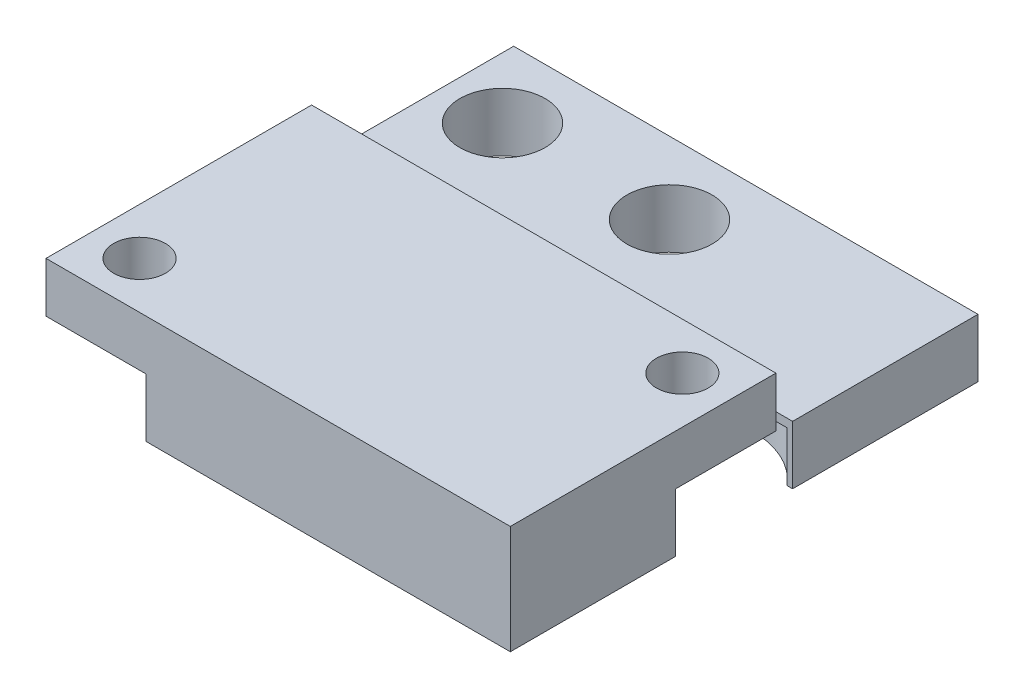
ISO-10303-21;
HEADER;
FILE_DESCRIPTION(('STEP AP214'),'2;1');
FILE_NAME('part.step','',(''),(''),'','','');
FILE_SCHEMA(('AUTOMOTIVE_DESIGN { 1 0 10303 214 1 1 1 1 }'));
ENDSEC;
DATA;
#1=APPLICATION_CONTEXT('core data for automotive mechanical design processes');
#2=APPLICATION_PROTOCOL_DEFINITION('international standard','automotive_design',2000,#1);
#3=PRODUCT_CONTEXT('',#1,'mechanical');
#4=PRODUCT('Part','Part','',(#3));
#5=PRODUCT_RELATED_PRODUCT_CATEGORY('part','',(#4));
#6=PRODUCT_DEFINITION_FORMATION('','',#4);
#7=PRODUCT_DEFINITION_CONTEXT('part definition',#1,'design');
#8=PRODUCT_DEFINITION('design','',#6,#7);
#9=PRODUCT_DEFINITION_SHAPE('','',#8);
#10=(LENGTH_UNIT() NAMED_UNIT(*) SI_UNIT(.MILLI.,.METRE.));
#11=(NAMED_UNIT(*) PLANE_ANGLE_UNIT() SI_UNIT($,.RADIAN.));
#12=(NAMED_UNIT(*) SI_UNIT($,.STERADIAN.) SOLID_ANGLE_UNIT());
#13=UNCERTAINTY_MEASURE_WITH_UNIT(LENGTH_MEASURE(1.E-05),#10,'distance_accuracy_value','');
#14=(GEOMETRIC_REPRESENTATION_CONTEXT(3) GLOBAL_UNCERTAINTY_ASSIGNED_CONTEXT((#13)) GLOBAL_UNIT_ASSIGNED_CONTEXT((#10,
#11,#12)) REPRESENTATION_CONTEXT('',''));
#15=CARTESIAN_POINT('',(0.,0.,0.));
#16=DIRECTION('',(0.,0.,1.));
#17=DIRECTION('',(1.,0.,0.));
#18=AXIS2_PLACEMENT_3D('',#15,#16,#17);
#19=CARTESIAN_POINT('',(21.8,3.5,0.));
#20=DIRECTION('',(1.,0.,0.));
#21=DIRECTION('',(0.,0.,-1.));
#22=AXIS2_PLACEMENT_3D('',#19,#20,#21);
#23=PLANE('',#22);
#24=DIRECTION('',(0.,-1.,0.));
#25=VECTOR('',#24,1.);
#26=CARTESIAN_POINT('',(21.8,3.5,-9.9));
#27=LINE('',#26,#25);
#28=CARTESIAN_POINT('',(21.8,3.5,-9.9));
#29=VERTEX_POINT('',#28);
#30=CARTESIAN_POINT('',(21.8,3.,-9.9));
#31=VERTEX_POINT('',#30);
#32=EDGE_CURVE('E184',#29,#31,#27,.T.);
#33=ORIENTED_EDGE('',*,*,#32,.T.);
#34=DIRECTION('',(0.,0.,-1.));
#35=VECTOR('',#34,1.);
#36=CARTESIAN_POINT('',(21.8,3.,0.));
#37=LINE('',#36,#35);
#38=CARTESIAN_POINT('',(21.8,3.,-16.9));
#39=VERTEX_POINT('',#38);
#40=EDGE_CURVE('E343',#31,#39,#37,.T.);
#41=ORIENTED_EDGE('',*,*,#40,.T.);
#42=DIRECTION('',(0.,-1.,0.));
#43=VECTOR('',#42,1.);
#44=CARTESIAN_POINT('',(21.8,3.5,-16.9));
#45=LINE('',#44,#43);
#46=CARTESIAN_POINT('',(21.8,3.5,-16.9));
#47=VERTEX_POINT('',#46);
#48=EDGE_CURVE('E195',#47,#39,#45,.T.);
#49=ORIENTED_EDGE('',*,*,#48,.F.);
#50=DIRECTION('',(0.,0.,1.));
#51=VECTOR('',#50,1.);
#52=CARTESIAN_POINT('',(21.8,3.5,0.));
#53=LINE('',#52,#51);
#54=CARTESIAN_POINT('',(21.8,3.5,-15.9));
#55=VERTEX_POINT('',#54);
#56=EDGE_CURVE('E62',#47,#55,#53,.T.);
#57=ORIENTED_EDGE('',*,*,#56,.T.);
#58=EDGE_CURVE('E176',#55,#29,#53,.T.);
#59=ORIENTED_EDGE('',*,*,#58,.T.);
#60=EDGE_LOOP('',(#33,#41,#49,#57,#59));
#61=FACE_BOUND('',#60,.T.);
#62=ADVANCED_FACE('F39',(#61),#23,.T.);
#63=CARTESIAN_POINT('',(0.,3.5,0.));
#64=DIRECTION('',(0.,-1.,0.));
#65=DIRECTION('',(0.,0.,-1.));
#66=AXIS2_PLACEMENT_3D('',#63,#64,#65);
#67=PLANE('',#66);
#68=CARTESIAN_POINT('',(3.65,3.5,-23.68));
#69=DIRECTION('',(0.,1.,0.));
#70=DIRECTION('',(0.,0.,1.));
#71=AXIS2_PLACEMENT_3D('',#68,#69,#70);
#72=CIRCLE('',#71,2.55);
#73=CARTESIAN_POINT('',(3.65,3.5,-21.13));
#74=VERTEX_POINT('',#73);
#75=EDGE_CURVE('E272',#74,#74,#72,.T.);
#76=ORIENTED_EDGE('',*,*,#75,.F.);
#77=EDGE_LOOP('',(#76));
#78=FACE_BOUND('',#77,.T.);
#79=CARTESIAN_POINT('',(13.65,3.5,-23.68));
#80=DIRECTION('',(0.,1.,0.));
#81=DIRECTION('',(0.,0.,1.));
#82=AXIS2_PLACEMENT_3D('',#79,#80,#81);
#83=CIRCLE('',#82,2.55);
#84=CARTESIAN_POINT('',(13.65,3.5,-21.13));
#85=VERTEX_POINT('',#84);
#86=EDGE_CURVE('E280',#85,#85,#83,.T.);
#87=ORIENTED_EDGE('',*,*,#86,.F.);
#88=EDGE_LOOP('',(#87));
#89=FACE_BOUND('',#88,.T.);
#90=ORIENTED_EDGE('',*,*,#56,.F.);
#91=DIRECTION('',(-1.,0.,0.));
#92=VECTOR('',#91,1.);
#93=CARTESIAN_POINT('',(0.,3.5,-16.9));
#94=LINE('',#93,#92);
#95=CARTESIAN_POINT('',(27.8,3.5,-16.9));
#96=VERTEX_POINT('',#95);
#97=EDGE_CURVE('E334',#96,#47,#94,.T.);
#98=ORIENTED_EDGE('',*,*,#97,.F.);
#99=DIRECTION('',(0.,0.,-1.));
#100=VECTOR('',#99,1.);
#101=CARTESIAN_POINT('',(27.8,3.5,0.));
#102=LINE('',#101,#100);
#103=CARTESIAN_POINT('',(27.8,3.5,-28.));
#104=VERTEX_POINT('',#103);
#105=EDGE_CURVE('E292',#96,#104,#102,.T.);
#106=ORIENTED_EDGE('',*,*,#105,.T.);
#107=DIRECTION('',(-1.,0.,0.));
#108=VECTOR('',#107,1.);
#109=CARTESIAN_POINT('',(0.,3.5,-28.));
#110=LINE('',#109,#108);
#111=CARTESIAN_POINT('',(0.,3.5,-28.));
#112=VERTEX_POINT('',#111);
#113=EDGE_CURVE('E296',#104,#112,#110,.T.);
#114=ORIENTED_EDGE('',*,*,#113,.T.);
#115=DIRECTION('',(0.,0.,1.));
#116=VECTOR('',#115,1.);
#117=CARTESIAN_POINT('',(0.,3.5,0.));
#118=LINE('',#117,#116);
#119=CARTESIAN_POINT('',(0.,3.5,-15.9));
#120=VERTEX_POINT('',#119);
#121=EDGE_CURVE('E288',#112,#120,#118,.T.);
#122=ORIENTED_EDGE('',*,*,#121,.T.);
#123=DIRECTION('',(-1.,0.,0.));
#124=VECTOR('',#123,1.);
#125=CARTESIAN_POINT('',(0.,3.5,-15.9));
#126=LINE('',#125,#124);
#127=EDGE_CURVE('E241',#55,#120,#126,.T.);
#128=ORIENTED_EDGE('',*,*,#127,.F.);
#129=EDGE_LOOP('',(#90,#98,#106,#114,#122,#128));
#130=FACE_BOUND('',#129,.T.);
#131=ADVANCED_FACE('F352',(#78,#89,#130),#67,.F.);
#132=CARTESIAN_POINT('',(27.8,3.5,0.));
#133=DIRECTION('',(-1.,0.,0.));
#134=DIRECTION('',(0.,0.,1.));
#135=AXIS2_PLACEMENT_3D('',#132,#133,#134);
#136=PLANE('',#135);
#137=DIRECTION('',(0.,-1.,0.));
#138=VECTOR('',#137,1.);
#139=CARTESIAN_POINT('',(27.8,3.5,-16.9));
#140=LINE('',#139,#138);
#141=CARTESIAN_POINT('',(27.8,0.,-16.9));
#142=VERTEX_POINT('',#141);
#143=EDGE_CURVE('E192',#96,#142,#140,.T.);
#144=ORIENTED_EDGE('',*,*,#143,.T.);
#145=DIRECTION('',(0.,0.,-1.));
#146=VECTOR('',#145,1.);
#147=CARTESIAN_POINT('',(27.8,0.,0.));
#148=LINE('',#147,#146);
#149=CARTESIAN_POINT('',(27.8,0.,-28.));
#150=VERTEX_POINT('',#149);
#151=EDGE_CURVE('E170',#142,#150,#148,.T.);
#152=ORIENTED_EDGE('',*,*,#151,.T.);
#153=DIRECTION('',(0.,-1.,0.));
#154=VECTOR('',#153,1.);
#155=CARTESIAN_POINT('',(27.8,3.5,-28.));
#156=LINE('',#155,#154);
#157=EDGE_CURVE('E315',#104,#150,#156,.T.);
#158=ORIENTED_EDGE('',*,*,#157,.F.);
#159=ORIENTED_EDGE('',*,*,#105,.F.);
#160=EDGE_LOOP('',(#144,#152,#158,#159));
#161=FACE_BOUND('',#160,.T.);
#162=ADVANCED_FACE('F356',(#161),#136,.F.);
#163=CARTESIAN_POINT('',(0.,0.,0.));
#164=DIRECTION('',(0.,-1.,0.));
#165=DIRECTION('',(0.,0.,-1.));
#166=AXIS2_PLACEMENT_3D('',#163,#164,#165);
#167=PLANE('',#166);
#168=CARTESIAN_POINT('',(23.65,0.,-13.68));
#169=DIRECTION('',(0.,-1.,0.));
#170=DIRECTION('',(0.,0.,-1.));
#171=AXIS2_PLACEMENT_3D('',#168,#169,#170);
#172=CIRCLE('',#171,5.);
#173=CARTESIAN_POINT('',(26.922858078194,0.,-9.9));
#174=VERTEX_POINT('',#173);
#175=CARTESIAN_POINT('',(27.4751274488571,0.,-16.9));
#176=VERTEX_POINT('',#175);
#177=EDGE_CURVE('E149',#174,#176,#172,.T.);
#178=ORIENTED_EDGE('',*,*,#177,.F.);
#179=DIRECTION('',(-1.,0.,0.));
#180=VECTOR('',#179,1.);
#181=CARTESIAN_POINT('',(0.,0.,-9.9));
#182=LINE('',#181,#180);
#183=CARTESIAN_POINT('',(27.8,0.,-9.9));
#184=VERTEX_POINT('',#183);
#185=EDGE_CURVE('E172',#184,#174,#182,.T.);
#186=ORIENTED_EDGE('',*,*,#185,.F.);
#187=CARTESIAN_POINT('',(27.8,0.,0.));
#188=VERTEX_POINT('',#187);
#189=EDGE_CURVE('E306',#188,#184,#148,.T.);
#190=ORIENTED_EDGE('',*,*,#189,.F.);
#191=DIRECTION('',(1.,0.,0.));
#192=VECTOR('',#191,1.);
#193=CARTESIAN_POINT('',(0.,0.,0.));
#194=LINE('',#193,#192);
#195=CARTESIAN_POINT('',(6.,0.,0.));
#196=VERTEX_POINT('',#195);
#197=EDGE_CURVE('E303',#196,#188,#194,.T.);
#198=ORIENTED_EDGE('',*,*,#197,.F.);
#199=DIRECTION('',(0.,0.,-1.));
#200=VECTOR('',#199,1.);
#201=CARTESIAN_POINT('',(6.,0.,0.));
#202=LINE('',#201,#200);
#203=CARTESIAN_POINT('',(6.,0.,-6.));
#204=VERTEX_POINT('',#203);
#205=EDGE_CURVE('E213',#196,#204,#202,.T.);
#206=ORIENTED_EDGE('',*,*,#205,.T.);
#207=DIRECTION('',(1.,0.,0.));
#208=VECTOR('',#207,1.);
#209=CARTESIAN_POINT('',(0.,0.,-6.));
#210=LINE('',#209,#208);
#211=CARTESIAN_POINT('',(0.,0.,-6.));
#212=VERTEX_POINT('',#211);
#213=EDGE_CURVE('E202',#212,#204,#210,.T.);
#214=ORIENTED_EDGE('',*,*,#213,.F.);
#215=DIRECTION('',(0.,0.,1.));
#216=VECTOR('',#215,1.);
#217=CARTESIAN_POINT('',(0.,0.,0.));
#218=LINE('',#217,#216);
#219=CARTESIAN_POINT('',(0.,0.,-28.));
#220=VERTEX_POINT('',#219);
#221=EDGE_CURVE('E284',#220,#212,#218,.T.);
#222=ORIENTED_EDGE('',*,*,#221,.F.);
#223=DIRECTION('',(-1.,0.,0.));
#224=VECTOR('',#223,1.);
#225=CARTESIAN_POINT('',(0.,0.,-28.));
#226=LINE('',#225,#224);
#227=EDGE_CURVE('E293',#150,#220,#226,.T.);
#228=ORIENTED_EDGE('',*,*,#227,.F.);
#229=ORIENTED_EDGE('',*,*,#151,.F.);
#230=DIRECTION('',(-1.,0.,0.));
#231=VECTOR('',#230,1.);
#232=CARTESIAN_POINT('',(0.,0.,-16.9));
#233=LINE('',#232,#231);
#234=EDGE_CURVE('E163',#142,#176,#233,.T.);
#235=ORIENTED_EDGE('',*,*,#234,.T.);
#236=EDGE_LOOP('',(#178,#186,#190,#198,#206,#214,#222,#228,#229,#235));
#237=FACE_BOUND('',#236,.T.);
#238=CARTESIAN_POINT('',(13.65,0.,-23.68));
#239=DIRECTION('',(0.,1.,0.));
#240=DIRECTION('',(0.,0.,1.));
#241=AXIS2_PLACEMENT_3D('',#238,#239,#240);
#242=CIRCLE('',#241,2.55);
#243=CARTESIAN_POINT('',(13.65,0.,-21.13));
#244=VERTEX_POINT('',#243);
#245=EDGE_CURVE('E276',#244,#244,#242,.T.);
#246=ORIENTED_EDGE('',*,*,#245,.T.);
#247=EDGE_LOOP('',(#246));
#248=FACE_BOUND('',#247,.T.);
#249=CARTESIAN_POINT('',(3.65,0.,-23.68));
#250=DIRECTION('',(0.,1.,0.));
#251=DIRECTION('',(0.,0.,1.));
#252=AXIS2_PLACEMENT_3D('',#249,#250,#251);
#253=CIRCLE('',#252,2.55);
#254=CARTESIAN_POINT('',(3.65,0.,-21.13));
#255=VERTEX_POINT('',#254);
#256=EDGE_CURVE('E271',#255,#255,#253,.T.);
#257=ORIENTED_EDGE('',*,*,#256,.T.);
#258=EDGE_LOOP('',(#257));
#259=FACE_BOUND('',#258,.T.);
#260=ADVANCED_FACE('F167',(#237,#248,#259),#167,.T.);
#261=CARTESIAN_POINT('',(0.,3.5,0.));
#262=DIRECTION('',(0.,0.,-1.));
#263=DIRECTION('',(-1.,0.,0.));
#264=AXIS2_PLACEMENT_3D('',#261,#262,#263);
#265=PLANE('',#264);
#266=DIRECTION('',(0.,-1.,0.));
#267=VECTOR('',#266,1.);
#268=CARTESIAN_POINT('',(6.,3.5,0.));
#269=LINE('',#268,#267);
#270=CARTESIAN_POINT('',(6.,3.5,0.));
#271=VERTEX_POINT('',#270);
#272=EDGE_CURVE('E212',#271,#196,#269,.T.);
#273=ORIENTED_EDGE('',*,*,#272,.T.);
#274=ORIENTED_EDGE('',*,*,#197,.T.);
#275=DIRECTION('',(0.,-1.,0.));
#276=VECTOR('',#275,1.);
#277=CARTESIAN_POINT('',(27.8,3.5,0.));
#278=LINE('',#277,#276);
#279=CARTESIAN_POINT('',(27.8,6.5,0.));
#280=VERTEX_POINT('',#279);
#281=EDGE_CURVE('E319',#280,#188,#278,.T.);
#282=ORIENTED_EDGE('',*,*,#281,.F.);
#283=DIRECTION('',(1.,0.,0.));
#284=VECTOR('',#283,1.);
#285=CARTESIAN_POINT('',(0.,6.5,0.));
#286=LINE('',#285,#284);
#287=CARTESIAN_POINT('',(0.,6.5,0.));
#288=VERTEX_POINT('',#287);
#289=EDGE_CURVE('E249',#288,#280,#286,.T.);
#290=ORIENTED_EDGE('',*,*,#289,.F.);
#291=DIRECTION('',(0.,-1.,0.));
#292=VECTOR('',#291,1.);
#293=CARTESIAN_POINT('',(0.,3.5,0.));
#294=LINE('',#293,#292);
#295=CARTESIAN_POINT('',(0.,3.5,0.));
#296=VERTEX_POINT('',#295);
#297=EDGE_CURVE('E323',#288,#296,#294,.T.);
#298=ORIENTED_EDGE('',*,*,#297,.T.);
#299=DIRECTION('',(-1.,0.,0.));
#300=VECTOR('',#299,1.);
#301=CARTESIAN_POINT('',(0.,3.5,0.));
#302=LINE('',#301,#300);
#303=EDGE_CURVE('E201',#271,#296,#302,.T.);
#304=ORIENTED_EDGE('',*,*,#303,.F.);
#305=EDGE_LOOP('',(#273,#274,#282,#290,#298,#304));
#306=FACE_BOUND('',#305,.T.);
#307=ADVANCED_FACE('F384',(#306),#265,.F.);
#308=CARTESIAN_POINT('',(0.,3.5,0.));
#309=DIRECTION('',(1.,0.,0.));
#310=DIRECTION('',(0.,0.,-1.));
#311=AXIS2_PLACEMENT_3D('',#308,#309,#310);
#312=PLANE('',#311);
#313=ORIENTED_EDGE('',*,*,#221,.T.);
#314=DIRECTION('',(0.,-1.,0.));
#315=VECTOR('',#314,1.);
#316=CARTESIAN_POINT('',(0.,3.5,-6.));
#317=LINE('',#316,#315);
#318=CARTESIAN_POINT('',(0.,3.5,-6.));
#319=VERTEX_POINT('',#318);
#320=EDGE_CURVE('E224',#319,#212,#317,.T.);
#321=ORIENTED_EDGE('',*,*,#320,.F.);
#322=DIRECTION('',(0.,0.,-1.));
#323=VECTOR('',#322,1.);
#324=CARTESIAN_POINT('',(0.,3.5,0.));
#325=LINE('',#324,#323);
#326=EDGE_CURVE('E205',#296,#319,#325,.T.);
#327=ORIENTED_EDGE('',*,*,#326,.F.);
#328=ORIENTED_EDGE('',*,*,#297,.F.);
#329=DIRECTION('',(0.,0.,1.));
#330=VECTOR('',#329,1.);
#331=CARTESIAN_POINT('',(0.,6.5,0.));
#332=LINE('',#331,#330);
#333=CARTESIAN_POINT('',(0.,6.5,-15.9));
#334=VERTEX_POINT('',#333);
#335=EDGE_CURVE('E245',#334,#288,#332,.T.);
#336=ORIENTED_EDGE('',*,*,#335,.F.);
#337=DIRECTION('',(0.,-1.,0.));
#338=VECTOR('',#337,1.);
#339=CARTESIAN_POINT('',(0.,6.5,-15.9));
#340=LINE('',#339,#338);
#341=EDGE_CURVE('E260',#334,#120,#340,.T.);
#342=ORIENTED_EDGE('',*,*,#341,.T.);
#343=ORIENTED_EDGE('',*,*,#121,.F.);
#344=DIRECTION('',(0.,-1.,0.));
#345=VECTOR('',#344,1.);
#346=CARTESIAN_POINT('',(0.,3.5,-28.));
#347=LINE('',#346,#345);
#348=EDGE_CURVE('E299',#112,#220,#347,.T.);
#349=ORIENTED_EDGE('',*,*,#348,.T.);
#350=EDGE_LOOP('',(#313,#321,#327,#328,#336,#342,#343,#349));
#351=FACE_BOUND('',#350,.T.);
#352=ADVANCED_FACE('F41',(#351),#312,.F.);
#353=ORIENTED_EDGE('',*,*,#189,.T.);
#354=DIRECTION('',(0.,-1.,0.));
#355=VECTOR('',#354,1.);
#356=CARTESIAN_POINT('',(27.8,3.5,-9.9));
#357=LINE('',#356,#355);
#358=CARTESIAN_POINT('',(27.8,3.5,-9.9));
#359=VERTEX_POINT('',#358);
#360=EDGE_CURVE('E189',#359,#184,#357,.T.);
#361=ORIENTED_EDGE('',*,*,#360,.F.);
#362=DIRECTION('',(0.,0.,1.));
#363=VECTOR('',#362,1.);
#364=CARTESIAN_POINT('',(27.8,3.5,0.));
#365=LINE('',#364,#363);
#366=CARTESIAN_POINT('',(27.8,3.5,-15.9));
#367=VERTEX_POINT('',#366);
#368=EDGE_CURVE('E332',#367,#359,#365,.T.);
#369=ORIENTED_EDGE('',*,*,#368,.F.);
#370=DIRECTION('',(0.,-1.,0.));
#371=VECTOR('',#370,1.);
#372=CARTESIAN_POINT('',(27.8,6.5,-15.9));
#373=LINE('',#372,#371);
#374=CARTESIAN_POINT('',(27.8,6.5,-15.9));
#375=VERTEX_POINT('',#374);
#376=EDGE_CURVE('E267',#375,#367,#373,.T.);
#377=ORIENTED_EDGE('',*,*,#376,.F.);
#378=DIRECTION('',(0.,0.,-1.));
#379=VECTOR('',#378,1.);
#380=CARTESIAN_POINT('',(27.8,6.5,0.));
#381=LINE('',#380,#379);
#382=EDGE_CURVE('E254',#280,#375,#381,.T.);
#383=ORIENTED_EDGE('',*,*,#382,.F.);
#384=ORIENTED_EDGE('',*,*,#281,.T.);
#385=EDGE_LOOP('',(#353,#361,#369,#377,#383,#384));
#386=FACE_BOUND('',#385,.T.);
#387=ADVANCED_FACE('F376',(#386),#136,.F.);
#388=CARTESIAN_POINT('',(0.,3.5,-28.));
#389=DIRECTION('',(0.,0.,1.));
#390=DIRECTION('',(1.,0.,0.));
#391=AXIS2_PLACEMENT_3D('',#388,#389,#390);
#392=PLANE('',#391);
#393=ORIENTED_EDGE('',*,*,#227,.T.);
#394=ORIENTED_EDGE('',*,*,#348,.F.);
#395=ORIENTED_EDGE('',*,*,#113,.F.);
#396=ORIENTED_EDGE('',*,*,#157,.T.);
#397=EDGE_LOOP('',(#393,#394,#395,#396));
#398=FACE_BOUND('',#397,.T.);
#399=ADVANCED_FACE('F360',(#398),#392,.F.);
#400=CARTESIAN_POINT('',(13.65,3.5,-23.68));
#401=DIRECTION('',(0.,-1.,0.));
#402=DIRECTION('',(0.,0.,-1.));
#403=AXIS2_PLACEMENT_3D('',#400,#401,#402);
#404=CYLINDRICAL_SURFACE('',#403,2.55);
#405=ORIENTED_EDGE('',*,*,#245,.F.);
#406=EDGE_LOOP('',(#405));
#407=FACE_BOUND('',#406,.T.);
#408=ORIENTED_EDGE('',*,*,#86,.T.);
#409=EDGE_LOOP('',(#408));
#410=FACE_BOUND('',#409,.T.);
#411=ADVANCED_FACE('F544',(#407,#410),#404,.F.);
#412=CARTESIAN_POINT('',(3.65,3.5,-23.68));
#413=DIRECTION('',(0.,-1.,0.));
#414=DIRECTION('',(0.,0.,-1.));
#415=AXIS2_PLACEMENT_3D('',#412,#413,#414);
#416=CYLINDRICAL_SURFACE('',#415,2.55);
#417=ORIENTED_EDGE('',*,*,#75,.T.);
#418=EDGE_LOOP('',(#417));
#419=FACE_BOUND('',#418,.T.);
#420=ORIENTED_EDGE('',*,*,#256,.F.);
#421=EDGE_LOOP('',(#420));
#422=FACE_BOUND('',#421,.T.);
#423=ADVANCED_FACE('F548',(#419,#422),#416,.F.);
#424=CARTESIAN_POINT('',(0.,6.5,0.));
#425=DIRECTION('',(0.,-1.,0.));
#426=DIRECTION('',(0.,0.,-1.));
#427=AXIS2_PLACEMENT_3D('',#424,#425,#426);
#428=PLANE('',#427);
#429=ORIENTED_EDGE('',*,*,#335,.T.);
#430=ORIENTED_EDGE('',*,*,#289,.T.);
#431=ORIENTED_EDGE('',*,*,#382,.T.);
#432=DIRECTION('',(-1.,0.,0.));
#433=VECTOR('',#432,1.);
#434=CARTESIAN_POINT('',(0.,6.5,-15.9));
#435=LINE('',#434,#433);
#436=EDGE_CURVE('E257',#375,#334,#435,.T.);
#437=ORIENTED_EDGE('',*,*,#436,.T.);
#438=EDGE_LOOP('',(#429,#430,#431,#437));
#439=FACE_BOUND('',#438,.T.);
#440=CARTESIAN_POINT('',(2.8,6.5,-2.8));
#441=DIRECTION('',(0.,1.,0.));
#442=DIRECTION('',(0.,0.,1.));
#443=AXIS2_PLACEMENT_3D('',#440,#441,#442);
#444=CIRCLE('',#443,1.55);
#445=CARTESIAN_POINT('',(2.8,6.5,-1.25));
#446=VERTEX_POINT('',#445);
#447=EDGE_CURVE('E234',#446,#446,#444,.T.);
#448=ORIENTED_EDGE('',*,*,#447,.F.);
#449=EDGE_LOOP('',(#448));
#450=FACE_BOUND('',#449,.T.);
#451=CARTESIAN_POINT('',(25.,6.5,-13.1));
#452=DIRECTION('',(0.,1.,0.));
#453=DIRECTION('',(0.,0.,1.));
#454=AXIS2_PLACEMENT_3D('',#451,#452,#453);
#455=CIRCLE('',#454,1.55);
#456=CARTESIAN_POINT('',(25.,6.5,-11.55));
#457=VERTEX_POINT('',#456);
#458=EDGE_CURVE('E230',#457,#457,#455,.T.);
#459=ORIENTED_EDGE('',*,*,#458,.F.);
#460=EDGE_LOOP('',(#459));
#461=FACE_BOUND('',#460,.T.);
#462=ADVANCED_FACE('F389',(#439,#450,#461),#428,.F.);
#463=CARTESIAN_POINT('',(0.,6.5,-15.9));
#464=DIRECTION('',(0.,0.,1.));
#465=DIRECTION('',(1.,0.,0.));
#466=AXIS2_PLACEMENT_3D('',#463,#464,#465);
#467=PLANE('',#466);
#468=EDGE_CURVE('E250',#367,#55,#126,.T.);
#469=ORIENTED_EDGE('',*,*,#468,.T.);
#470=ORIENTED_EDGE('',*,*,#127,.T.);
#471=ORIENTED_EDGE('',*,*,#341,.F.);
#472=ORIENTED_EDGE('',*,*,#436,.F.);
#473=ORIENTED_EDGE('',*,*,#376,.T.);
#474=EDGE_LOOP('',(#469,#470,#471,#472,#473));
#475=FACE_BOUND('',#474,.T.);
#476=ADVANCED_FACE('F367',(#475),#467,.F.);
#477=CARTESIAN_POINT('',(2.8,6.5,-2.8));
#478=DIRECTION('',(0.,-1.,0.));
#479=DIRECTION('',(0.,0.,-1.));
#480=AXIS2_PLACEMENT_3D('',#477,#478,#479);
#481=CYLINDRICAL_SURFACE('',#480,1.55);
#482=ORIENTED_EDGE('',*,*,#447,.T.);
#483=EDGE_LOOP('',(#482));
#484=FACE_BOUND('',#483,.T.);
#485=CARTESIAN_POINT('',(2.8,3.5,-2.8));
#486=DIRECTION('',(0.,1.,0.));
#487=DIRECTION('',(0.,0.,1.));
#488=AXIS2_PLACEMENT_3D('',#485,#486,#487);
#489=CIRCLE('',#488,1.55);
#490=CARTESIAN_POINT('',(2.8,3.5,-1.25));
#491=VERTEX_POINT('',#490);
#492=EDGE_CURVE('E223',#491,#491,#489,.T.);
#493=ORIENTED_EDGE('',*,*,#492,.F.);
#494=EDGE_LOOP('',(#493));
#495=FACE_BOUND('',#494,.T.);
#496=ADVANCED_FACE('F493',(#484,#495),#481,.F.);
#497=CARTESIAN_POINT('',(25.,6.5,-13.1));
#498=DIRECTION('',(0.,-1.,0.));
#499=DIRECTION('',(0.,0.,-1.));
#500=AXIS2_PLACEMENT_3D('',#497,#498,#499);
#501=CYLINDRICAL_SURFACE('',#500,1.55);
#502=ORIENTED_EDGE('',*,*,#458,.T.);
#503=EDGE_LOOP('',(#502));
#504=FACE_BOUND('',#503,.T.);
#505=CARTESIAN_POINT('',(25.,3.5,-13.1));
#506=DIRECTION('',(0.,1.,0.));
#507=DIRECTION('',(0.,0.,1.));
#508=AXIS2_PLACEMENT_3D('',#505,#506,#507);
#509=CIRCLE('',#508,1.55);
#510=CARTESIAN_POINT('',(25.,3.5,-11.55));
#511=VERTEX_POINT('',#510);
#512=EDGE_CURVE('E188',#511,#511,#509,.T.);
#513=ORIENTED_EDGE('',*,*,#512,.F.);
#514=EDGE_LOOP('',(#513));
#515=FACE_BOUND('',#514,.T.);
#516=ADVANCED_FACE('F409',(#504,#515),#501,.F.);
#517=CARTESIAN_POINT('',(0.,3.5,0.));
#518=DIRECTION('',(0.,-1.,0.));
#519=DIRECTION('',(0.,0.,-1.));
#520=AXIS2_PLACEMENT_3D('',#517,#518,#519);
#521=PLANE('',#520);
#522=DIRECTION('',(0.,0.,-1.));
#523=VECTOR('',#522,1.);
#524=CARTESIAN_POINT('',(6.,3.5,0.));
#525=LINE('',#524,#523);
#526=CARTESIAN_POINT('',(6.,3.5,-6.));
#527=VERTEX_POINT('',#526);
#528=EDGE_CURVE('E198',#271,#527,#525,.T.);
#529=ORIENTED_EDGE('',*,*,#528,.F.);
#530=ORIENTED_EDGE('',*,*,#303,.T.);
#531=ORIENTED_EDGE('',*,*,#326,.T.);
#532=DIRECTION('',(1.,0.,0.));
#533=VECTOR('',#532,1.);
#534=CARTESIAN_POINT('',(0.,3.5,-6.));
#535=LINE('',#534,#533);
#536=EDGE_CURVE('E208',#319,#527,#535,.T.);
#537=ORIENTED_EDGE('',*,*,#536,.T.);
#538=EDGE_LOOP('',(#529,#530,#531,#537));
#539=FACE_BOUND('',#538,.T.);
#540=ORIENTED_EDGE('',*,*,#492,.T.);
#541=EDGE_LOOP('',(#540));
#542=FACE_BOUND('',#541,.T.);
#543=ADVANCED_FACE('F395',(#539,#542),#521,.T.);
#544=CARTESIAN_POINT('',(6.,3.5,0.));
#545=DIRECTION('',(-1.,0.,0.));
#546=DIRECTION('',(0.,0.,1.));
#547=AXIS2_PLACEMENT_3D('',#544,#545,#546);
#548=PLANE('',#547);
#549=ORIENTED_EDGE('',*,*,#205,.F.);
#550=ORIENTED_EDGE('',*,*,#272,.F.);
#551=ORIENTED_EDGE('',*,*,#528,.T.);
#552=DIRECTION('',(0.,-1.,0.));
#553=VECTOR('',#552,1.);
#554=CARTESIAN_POINT('',(6.,3.5,-6.));
#555=LINE('',#554,#553);
#556=EDGE_CURVE('E220',#527,#204,#555,.T.);
#557=ORIENTED_EDGE('',*,*,#556,.T.);
#558=EDGE_LOOP('',(#549,#550,#551,#557));
#559=FACE_BOUND('',#558,.T.);
#560=ADVANCED_FACE('F401',(#559),#548,.T.);
#561=CARTESIAN_POINT('',(0.,3.5,-6.));
#562=DIRECTION('',(0.,0.,-1.));
#563=DIRECTION('',(-1.,0.,0.));
#564=AXIS2_PLACEMENT_3D('',#561,#562,#563);
#565=PLANE('',#564);
#566=ORIENTED_EDGE('',*,*,#213,.T.);
#567=ORIENTED_EDGE('',*,*,#556,.F.);
#568=ORIENTED_EDGE('',*,*,#536,.F.);
#569=ORIENTED_EDGE('',*,*,#320,.T.);
#570=EDGE_LOOP('',(#566,#567,#568,#569));
#571=FACE_BOUND('',#570,.T.);
#572=ADVANCED_FACE('F399',(#571),#565,.F.);
#573=CARTESIAN_POINT('',(0.,3.5,0.));
#574=DIRECTION('',(0.,-1.,0.));
#575=DIRECTION('',(0.,0.,-1.));
#576=AXIS2_PLACEMENT_3D('',#573,#574,#575);
#577=PLANE('',#576);
#578=ORIENTED_EDGE('',*,*,#468,.F.);
#579=ORIENTED_EDGE('',*,*,#368,.T.);
#580=DIRECTION('',(-1.,0.,0.));
#581=VECTOR('',#580,1.);
#582=CARTESIAN_POINT('',(0.,3.5,-9.9));
#583=LINE('',#582,#581);
#584=EDGE_CURVE('E181',#359,#29,#583,.T.);
#585=ORIENTED_EDGE('',*,*,#584,.T.);
#586=ORIENTED_EDGE('',*,*,#58,.F.);
#587=EDGE_LOOP('',(#578,#579,#585,#586));
#588=FACE_BOUND('',#587,.T.);
#589=ORIENTED_EDGE('',*,*,#512,.T.);
#590=EDGE_LOOP('',(#589));
#591=FACE_BOUND('',#590,.T.);
#592=ADVANCED_FACE('F371',(#588,#591),#577,.T.);
#593=CARTESIAN_POINT('',(0.,3.5,-9.9));
#594=DIRECTION('',(0.,0.,1.));
#595=DIRECTION('',(1.,0.,0.));
#596=AXIS2_PLACEMENT_3D('',#593,#594,#595);
#597=PLANE('',#596);
#598=ORIENTED_EDGE('',*,*,#185,.T.);
#599=DIRECTION('',(0.,-1.,0.));
#600=VECTOR('',#599,1.);
#601=CARTESIAN_POINT('',(26.922858078194,3.,-9.9));
#602=LINE('',#601,#600);
#603=CARTESIAN_POINT('',(26.922858078194,3.,-9.9));
#604=VERTEX_POINT('',#603);
#605=EDGE_CURVE('E154',#174,#604,#602,.F.);
#606=ORIENTED_EDGE('',*,*,#605,.T.);
#607=DIRECTION('',(1.,0.,0.));
#608=VECTOR('',#607,1.);
#609=CARTESIAN_POINT('',(0.,3.,-9.9));
#610=LINE('',#609,#608);
#611=EDGE_CURVE('E178',#31,#604,#610,.T.);
#612=ORIENTED_EDGE('',*,*,#611,.F.);
#613=ORIENTED_EDGE('',*,*,#32,.F.);
#614=ORIENTED_EDGE('',*,*,#584,.F.);
#615=ORIENTED_EDGE('',*,*,#360,.T.);
#616=EDGE_LOOP('',(#598,#606,#612,#613,#614,#615));
#617=FACE_BOUND('',#616,.T.);
#618=ADVANCED_FACE('F380',(#617),#597,.F.);
#619=CARTESIAN_POINT('',(0.,3.5,-16.9));
#620=DIRECTION('',(0.,0.,1.));
#621=DIRECTION('',(1.,0.,0.));
#622=AXIS2_PLACEMENT_3D('',#619,#620,#621);
#623=PLANE('',#622);
#624=DIRECTION('',(0.,-1.,0.));
#625=VECTOR('',#624,1.);
#626=CARTESIAN_POINT('',(27.4751274488571,3.,-16.9));
#627=LINE('',#626,#625);
#628=CARTESIAN_POINT('',(27.4751274488571,3.,-16.9));
#629=VERTEX_POINT('',#628);
#630=EDGE_CURVE('E11',#176,#629,#627,.F.);
#631=ORIENTED_EDGE('',*,*,#630,.F.);
#632=ORIENTED_EDGE('',*,*,#234,.F.);
#633=ORIENTED_EDGE('',*,*,#143,.F.);
#634=ORIENTED_EDGE('',*,*,#97,.T.);
#635=ORIENTED_EDGE('',*,*,#48,.T.);
#636=DIRECTION('',(1.,0.,0.));
#637=VECTOR('',#636,1.);
#638=CARTESIAN_POINT('',(0.,3.,-16.9));
#639=LINE('',#638,#637);
#640=EDGE_CURVE('E48',#39,#629,#639,.T.);
#641=ORIENTED_EDGE('',*,*,#640,.T.);
#642=EDGE_LOOP('',(#631,#632,#633,#634,#635,#641));
#643=FACE_BOUND('',#642,.T.);
#644=ADVANCED_FACE('F162',(#643),#623,.T.);
#645=CARTESIAN_POINT('',(23.65,3.,-13.68));
#646=DIRECTION('',(0.,-1.,0.));
#647=DIRECTION('',(0.,0.,-1.));
#648=AXIS2_PLACEMENT_3D('',#645,#646,#647);
#649=CYLINDRICAL_SURFACE('',#648,5.);
#650=ORIENTED_EDGE('',*,*,#177,.T.);
#651=ORIENTED_EDGE('',*,*,#630,.T.);
#652=CARTESIAN_POINT('',(23.65,3.,-13.68));
#653=DIRECTION('',(0.,-1.,0.));
#654=DIRECTION('',(0.,0.,-1.));
#655=AXIS2_PLACEMENT_3D('',#652,#653,#654);
#656=CIRCLE('',#655,5.);
#657=EDGE_CURVE('E55',#604,#629,#656,.T.);
#658=ORIENTED_EDGE('',*,*,#657,.F.);
#659=ORIENTED_EDGE('',*,*,#605,.F.);
#660=EDGE_LOOP('',(#650,#651,#658,#659));
#661=FACE_BOUND('',#660,.T.);
#662=ADVANCED_FACE('F151',(#661),#649,.F.);
#663=CARTESIAN_POINT('',(23.65,3.,-13.68));
#664=DIRECTION('',(0.,-1.,0.));
#665=DIRECTION('',(0.,0.,-1.));
#666=AXIS2_PLACEMENT_3D('',#663,#664,#665);
#667=PLANE('',#666);
#668=ORIENTED_EDGE('',*,*,#611,.T.);
#669=ORIENTED_EDGE('',*,*,#657,.T.);
#670=ORIENTED_EDGE('',*,*,#640,.F.);
#671=ORIENTED_EDGE('',*,*,#40,.F.);
#672=EDGE_LOOP('',(#668,#669,#670,#671));
#673=FACE_BOUND('',#672,.T.);
#674=ADVANCED_FACE('F428',(#673),#667,.T.);
#675=CLOSED_SHELL('',(#62,#131,#162,#260,#307,#352,#387,#399,#411,#423,#462,#476,#496,#516,#543,
#560,#572,#592,#618,#644,#662,#674));
#676=MANIFOLD_SOLID_BREP('B2',#675);
#677=ADVANCED_BREP_SHAPE_REPRESENTATION('',(#18,#676),#14);
#678=SHAPE_DEFINITION_REPRESENTATION(#9,#677);
ENDSEC;
END-ISO-10303-21;
